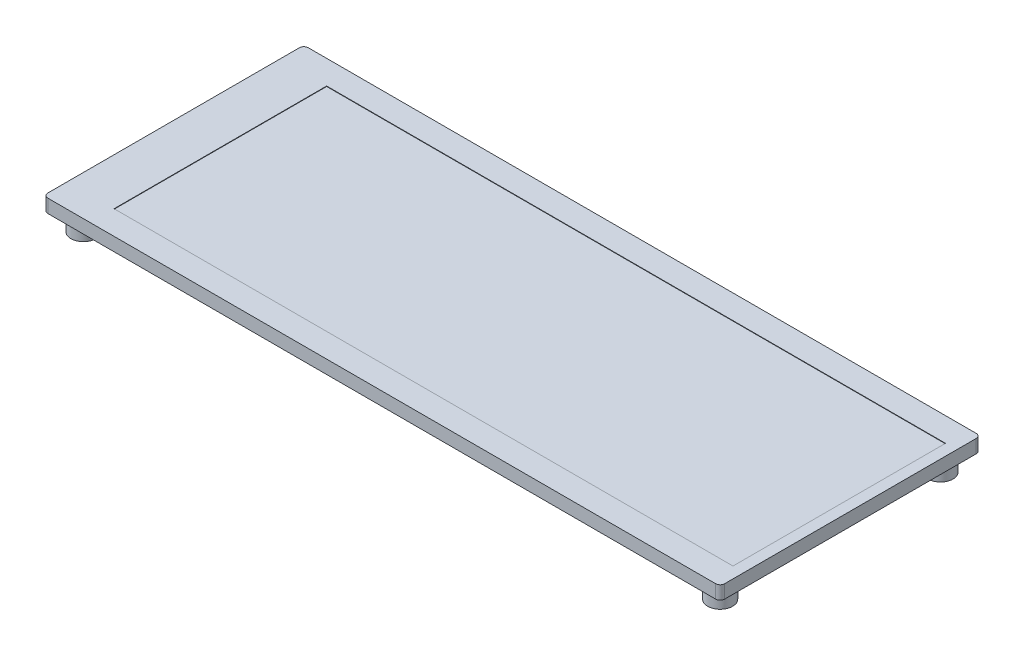
ISO-10303-21;
HEADER;
FILE_DESCRIPTION(('STEP AP214'),'2;1');
FILE_NAME('part.step','',(''),(''),'','','');
FILE_SCHEMA(('AUTOMOTIVE_DESIGN { 1 0 10303 214 1 1 1 1 }'));
ENDSEC;
DATA;
#1=APPLICATION_CONTEXT('core data for automotive mechanical design processes');
#2=APPLICATION_PROTOCOL_DEFINITION('international standard','automotive_design',2000,#1);
#3=PRODUCT_CONTEXT('',#1,'mechanical');
#4=PRODUCT('Part','Part','',(#3));
#5=PRODUCT_RELATED_PRODUCT_CATEGORY('part','',(#4));
#6=PRODUCT_DEFINITION_FORMATION('','',#4);
#7=PRODUCT_DEFINITION_CONTEXT('part definition',#1,'design');
#8=PRODUCT_DEFINITION('design','',#6,#7);
#9=PRODUCT_DEFINITION_SHAPE('','',#8);
#10=(LENGTH_UNIT() NAMED_UNIT(*) SI_UNIT(.MILLI.,.METRE.));
#11=(NAMED_UNIT(*) PLANE_ANGLE_UNIT() SI_UNIT($,.RADIAN.));
#12=(NAMED_UNIT(*) SI_UNIT($,.STERADIAN.) SOLID_ANGLE_UNIT());
#13=UNCERTAINTY_MEASURE_WITH_UNIT(LENGTH_MEASURE(1.E-05),#10,'distance_accuracy_value','');
#14=(GEOMETRIC_REPRESENTATION_CONTEXT(3) GLOBAL_UNCERTAINTY_ASSIGNED_CONTEXT((#13)) GLOBAL_UNIT_ASSIGNED_CONTEXT((#10,
#11,#12)) REPRESENTATION_CONTEXT('',''));
#15=CARTESIAN_POINT('',(0.,0.,0.));
#16=DIRECTION('',(0.,0.,1.));
#17=DIRECTION('',(1.,0.,0.));
#18=AXIS2_PLACEMENT_3D('',#15,#16,#17);
#19=CARTESIAN_POINT('',(75.,0.,-28.25));
#20=DIRECTION('',(0.,-1.,0.));
#21=DIRECTION('',(0.,0.,-1.));
#22=AXIS2_PLACEMENT_3D('',#19,#20,#21);
#23=PLANE('',#22);
#24=CARTESIAN_POINT('',(71.5,0.,-24.75));
#25=DIRECTION('',(0.,-1.,0.));
#26=DIRECTION('',(0.,0.,1.));
#27=AXIS2_PLACEMENT_3D('',#24,#25,#26);
#28=CIRCLE('',#27,2.79999999999999);
#29=CARTESIAN_POINT('',(71.5,0.,-21.95));
#30=VERTEX_POINT('',#29);
#31=EDGE_CURVE('E243',#30,#30,#28,.T.);
#32=ORIENTED_EDGE('',*,*,#31,.F.);
#33=EDGE_LOOP('',(#32));
#34=FACE_BOUND('',#33,.T.);
#35=CARTESIAN_POINT('',(71.5,0.,24.75));
#36=DIRECTION('',(0.,-1.,0.));
#37=DIRECTION('',(0.,0.,-1.));
#38=AXIS2_PLACEMENT_3D('',#35,#36,#37);
#39=CIRCLE('',#38,2.79999999999999);
#40=CARTESIAN_POINT('',(71.5,0.,21.95));
#41=VERTEX_POINT('',#40);
#42=EDGE_CURVE('E11',#41,#41,#39,.T.);
#43=ORIENTED_EDGE('',*,*,#42,.F.);
#44=EDGE_LOOP('',(#43));
#45=FACE_BOUND('',#44,.T.);
#46=CARTESIAN_POINT('',(-71.5,0.,-24.75));
#47=DIRECTION('',(0.,-1.,0.));
#48=DIRECTION('',(0.,0.,-1.));
#49=AXIS2_PLACEMENT_3D('',#46,#47,#48);
#50=CIRCLE('',#49,2.79999999999999);
#51=CARTESIAN_POINT('',(-71.5,0.,-27.55));
#52=VERTEX_POINT('',#51);
#53=EDGE_CURVE('E41',#52,#52,#50,.T.);
#54=ORIENTED_EDGE('',*,*,#53,.F.);
#55=EDGE_LOOP('',(#54));
#56=FACE_BOUND('',#55,.T.);
#57=CARTESIAN_POINT('',(-71.5,0.,24.75));
#58=DIRECTION('',(0.,-1.,0.));
#59=DIRECTION('',(0.,0.,-1.));
#60=AXIS2_PLACEMENT_3D('',#57,#58,#59);
#61=CIRCLE('',#60,2.79999999999999);
#62=CARTESIAN_POINT('',(-71.5,0.,21.95));
#63=VERTEX_POINT('',#62);
#64=EDGE_CURVE('E261',#63,#63,#61,.T.);
#65=ORIENTED_EDGE('',*,*,#64,.F.);
#66=EDGE_LOOP('',(#65));
#67=FACE_BOUND('',#66,.T.);
#68=CARTESIAN_POINT('',(75.,0.,-28.25));
#69=DIRECTION('',(0.,1.,0.));
#70=DIRECTION('',(0.,0.,-1.));
#71=AXIS2_PLACEMENT_3D('',#68,#69,#70);
#72=CIRCLE('',#71,1.);
#73=CARTESIAN_POINT('',(76.,0.,-28.25));
#74=VERTEX_POINT('',#73);
#75=CARTESIAN_POINT('',(75.,0.,-29.25));
#76=VERTEX_POINT('',#75);
#77=EDGE_CURVE('E295',#74,#76,#72,.T.);
#78=ORIENTED_EDGE('',*,*,#77,.F.);
#79=DIRECTION('',(0.,0.,-1.));
#80=VECTOR('',#79,1.);
#81=CARTESIAN_POINT('',(76.,0.,-28.25));
#82=LINE('',#81,#80);
#83=CARTESIAN_POINT('',(76.,0.,28.25));
#84=VERTEX_POINT('',#83);
#85=EDGE_CURVE('E306',#84,#74,#82,.T.);
#86=ORIENTED_EDGE('',*,*,#85,.F.);
#87=CARTESIAN_POINT('',(75.,0.,28.25));
#88=DIRECTION('',(0.,1.,0.));
#89=DIRECTION('',(0.,0.,1.));
#90=AXIS2_PLACEMENT_3D('',#87,#88,#89);
#91=CIRCLE('',#90,1.);
#92=CARTESIAN_POINT('',(75.,0.,29.25));
#93=VERTEX_POINT('',#92);
#94=EDGE_CURVE('E333',#93,#84,#91,.T.);
#95=ORIENTED_EDGE('',*,*,#94,.F.);
#96=DIRECTION('',(1.,0.,0.));
#97=VECTOR('',#96,1.);
#98=CARTESIAN_POINT('',(-75.,0.,29.25));
#99=LINE('',#98,#97);
#100=CARTESIAN_POINT('',(-75.,0.,29.25));
#101=VERTEX_POINT('',#100);
#102=EDGE_CURVE('E331',#101,#93,#99,.T.);
#103=ORIENTED_EDGE('',*,*,#102,.F.);
#104=CARTESIAN_POINT('',(-75.,0.,28.25));
#105=DIRECTION('',(0.,1.,0.));
#106=DIRECTION('',(0.,0.,1.));
#107=AXIS2_PLACEMENT_3D('',#104,#105,#106);
#108=CIRCLE('',#107,1.);
#109=CARTESIAN_POINT('',(-76.,0.,28.25));
#110=VERTEX_POINT('',#109);
#111=EDGE_CURVE('E329',#110,#101,#108,.T.);
#112=ORIENTED_EDGE('',*,*,#111,.F.);
#113=DIRECTION('',(0.,0.,1.));
#114=VECTOR('',#113,1.);
#115=CARTESIAN_POINT('',(-76.,0.,-28.25));
#116=LINE('',#115,#114);
#117=CARTESIAN_POINT('',(-76.,0.,-28.25));
#118=VERTEX_POINT('',#117);
#119=EDGE_CURVE('E327',#118,#110,#116,.T.);
#120=ORIENTED_EDGE('',*,*,#119,.F.);
#121=CARTESIAN_POINT('',(-75.,0.,-28.25));
#122=DIRECTION('',(0.,1.,0.));
#123=DIRECTION('',(0.,0.,1.));
#124=AXIS2_PLACEMENT_3D('',#121,#122,#123);
#125=CIRCLE('',#124,1.);
#126=CARTESIAN_POINT('',(-75.,0.,-29.25));
#127=VERTEX_POINT('',#126);
#128=EDGE_CURVE('E325',#127,#118,#125,.T.);
#129=ORIENTED_EDGE('',*,*,#128,.F.);
#130=DIRECTION('',(-1.,0.,0.));
#131=VECTOR('',#130,1.);
#132=CARTESIAN_POINT('',(-75.,0.,-29.25));
#133=LINE('',#132,#131);
#134=EDGE_CURVE('E323',#76,#127,#133,.T.);
#135=ORIENTED_EDGE('',*,*,#134,.F.);
#136=EDGE_LOOP('',(#78,#86,#95,#103,#112,#120,#129,#135));
#137=FACE_BOUND('',#136,.T.);
#138=DIRECTION('',(-1.,0.,0.));
#139=VECTOR('',#138,1.);
#140=CARTESIAN_POINT('',(-63.,0.,5.5));
#141=LINE('',#140,#139);
#142=CARTESIAN_POINT('',(-57.,0.,5.5));
#143=VERTEX_POINT('',#142);
#144=CARTESIAN_POINT('',(-63.,0.,5.5));
#145=VERTEX_POINT('',#144);
#146=EDGE_CURVE('E199',#143,#145,#141,.T.);
#147=ORIENTED_EDGE('',*,*,#146,.F.);
#148=DIRECTION('',(0.,0.,1.));
#149=VECTOR('',#148,1.);
#150=CARTESIAN_POINT('',(-57.,0.,5.5));
#151=LINE('',#150,#149);
#152=CARTESIAN_POINT('',(-57.,0.,-5.5));
#153=VERTEX_POINT('',#152);
#154=EDGE_CURVE('E196',#153,#143,#151,.T.);
#155=ORIENTED_EDGE('',*,*,#154,.F.);
#156=DIRECTION('',(1.,0.,0.));
#157=VECTOR('',#156,1.);
#158=CARTESIAN_POINT('',(-63.,0.,-5.5));
#159=LINE('',#158,#157);
#160=CARTESIAN_POINT('',(-63.,0.,-5.5));
#161=VERTEX_POINT('',#160);
#162=EDGE_CURVE('E208',#161,#153,#159,.T.);
#163=ORIENTED_EDGE('',*,*,#162,.F.);
#164=DIRECTION('',(0.,0.,-1.));
#165=VECTOR('',#164,1.);
#166=CARTESIAN_POINT('',(-63.,0.,5.5));
#167=LINE('',#166,#165);
#168=EDGE_CURVE('E216',#145,#161,#167,.T.);
#169=ORIENTED_EDGE('',*,*,#168,.F.);
#170=EDGE_LOOP('',(#147,#155,#163,#169));
#171=FACE_BOUND('',#170,.T.);
#172=DIRECTION('',(-1.,0.,0.));
#173=VECTOR('',#172,1.);
#174=CARTESIAN_POINT('',(61.5,0.,8.5));
#175=LINE('',#174,#173);
#176=CARTESIAN_POINT('',(67.5,0.,8.5));
#177=VERTEX_POINT('',#176);
#178=CARTESIAN_POINT('',(61.5,0.,8.5));
#179=VERTEX_POINT('',#178);
#180=EDGE_CURVE('E377',#177,#179,#175,.T.);
#181=ORIENTED_EDGE('',*,*,#180,.F.);
#182=DIRECTION('',(0.,0.,1.));
#183=VECTOR('',#182,1.);
#184=CARTESIAN_POINT('',(67.5,0.,8.5));
#185=LINE('',#184,#183);
#186=CARTESIAN_POINT('',(67.5,0.,-8.5));
#187=VERTEX_POINT('',#186);
#188=EDGE_CURVE('E194',#187,#177,#185,.T.);
#189=ORIENTED_EDGE('',*,*,#188,.F.);
#190=DIRECTION('',(1.,0.,0.));
#191=VECTOR('',#190,1.);
#192=CARTESIAN_POINT('',(61.5,0.,-8.5));
#193=LINE('',#192,#191);
#194=CARTESIAN_POINT('',(61.5,0.,-8.5));
#195=VERTEX_POINT('',#194);
#196=EDGE_CURVE('E190',#195,#187,#193,.T.);
#197=ORIENTED_EDGE('',*,*,#196,.F.);
#198=DIRECTION('',(0.,0.,-1.));
#199=VECTOR('',#198,1.);
#200=CARTESIAN_POINT('',(61.5,0.,8.5));
#201=LINE('',#200,#199);
#202=EDGE_CURVE('E379',#179,#195,#201,.T.);
#203=ORIENTED_EDGE('',*,*,#202,.F.);
#204=EDGE_LOOP('',(#181,#189,#197,#203));
#205=FACE_BOUND('',#204,.T.);
#206=ADVANCED_FACE('F33',(#34,#45,#56,#67,#137,#171,#205),#23,.T.);
#207=CARTESIAN_POINT('',(75.,3.,-28.25));
#208=DIRECTION('',(0.,-1.,0.));
#209=DIRECTION('',(0.,0.,-1.));
#210=AXIS2_PLACEMENT_3D('',#207,#208,#209);
#211=CYLINDRICAL_SURFACE('',#210,1.);
#212=ORIENTED_EDGE('',*,*,#77,.T.);
#213=DIRECTION('',(0.,-1.,0.));
#214=VECTOR('',#213,1.);
#215=CARTESIAN_POINT('',(75.,3.,-29.25));
#216=LINE('',#215,#214);
#217=CARTESIAN_POINT('',(75.,3.,-29.25));
#218=VERTEX_POINT('',#217);
#219=EDGE_CURVE('E356',#218,#76,#216,.T.);
#220=ORIENTED_EDGE('',*,*,#219,.F.);
#221=CARTESIAN_POINT('',(75.,3.,-28.25));
#222=DIRECTION('',(0.,1.,0.));
#223=DIRECTION('',(0.,0.,-1.));
#224=AXIS2_PLACEMENT_3D('',#221,#222,#223);
#225=CIRCLE('',#224,1.);
#226=CARTESIAN_POINT('',(76.,3.,-28.25));
#227=VERTEX_POINT('',#226);
#228=EDGE_CURVE('E302',#227,#218,#225,.T.);
#229=ORIENTED_EDGE('',*,*,#228,.F.);
#230=DIRECTION('',(0.,-1.,0.));
#231=VECTOR('',#230,1.);
#232=CARTESIAN_POINT('',(76.,3.,-28.25));
#233=LINE('',#232,#231);
#234=EDGE_CURVE('E320',#227,#74,#233,.T.);
#235=ORIENTED_EDGE('',*,*,#234,.T.);
#236=EDGE_LOOP('',(#212,#220,#229,#235));
#237=FACE_BOUND('',#236,.T.);
#238=ADVANCED_FACE('F35',(#237),#211,.T.);
#239=CARTESIAN_POINT('',(-75.,3.,-29.25));
#240=DIRECTION('',(0.,0.,1.));
#241=DIRECTION('',(1.,0.,0.));
#242=AXIS2_PLACEMENT_3D('',#239,#240,#241);
#243=PLANE('',#242);
#244=ORIENTED_EDGE('',*,*,#134,.T.);
#245=DIRECTION('',(0.,-1.,0.));
#246=VECTOR('',#245,1.);
#247=CARTESIAN_POINT('',(-75.,3.,-29.25));
#248=LINE('',#247,#246);
#249=CARTESIAN_POINT('',(-75.,3.,-29.25));
#250=VERTEX_POINT('',#249);
#251=EDGE_CURVE('E353',#250,#127,#248,.T.);
#252=ORIENTED_EDGE('',*,*,#251,.F.);
#253=DIRECTION('',(-1.,0.,0.));
#254=VECTOR('',#253,1.);
#255=CARTESIAN_POINT('',(-75.,3.,-29.25));
#256=LINE('',#255,#254);
#257=EDGE_CURVE('E305',#218,#250,#256,.T.);
#258=ORIENTED_EDGE('',*,*,#257,.F.);
#259=ORIENTED_EDGE('',*,*,#219,.T.);
#260=EDGE_LOOP('',(#244,#252,#258,#259));
#261=FACE_BOUND('',#260,.T.);
#262=ADVANCED_FACE('F532',(#261),#243,.F.);
#263=CARTESIAN_POINT('',(-75.,3.,-28.25));
#264=DIRECTION('',(0.,-1.,0.));
#265=DIRECTION('',(0.,0.,-1.));
#266=AXIS2_PLACEMENT_3D('',#263,#264,#265);
#267=CYLINDRICAL_SURFACE('',#266,1.);
#268=ORIENTED_EDGE('',*,*,#128,.T.);
#269=DIRECTION('',(0.,-1.,0.));
#270=VECTOR('',#269,1.);
#271=CARTESIAN_POINT('',(-76.,3.,-28.25));
#272=LINE('',#271,#270);
#273=CARTESIAN_POINT('',(-76.,3.,-28.25));
#274=VERTEX_POINT('',#273);
#275=EDGE_CURVE('E350',#274,#118,#272,.T.);
#276=ORIENTED_EDGE('',*,*,#275,.F.);
#277=CARTESIAN_POINT('',(-75.,3.,-28.25));
#278=DIRECTION('',(0.,1.,0.));
#279=DIRECTION('',(0.,0.,1.));
#280=AXIS2_PLACEMENT_3D('',#277,#278,#279);
#281=CIRCLE('',#280,1.);
#282=EDGE_CURVE('E308',#250,#274,#281,.T.);
#283=ORIENTED_EDGE('',*,*,#282,.F.);
#284=ORIENTED_EDGE('',*,*,#251,.T.);
#285=EDGE_LOOP('',(#268,#276,#283,#284));
#286=FACE_BOUND('',#285,.T.);
#287=ADVANCED_FACE('F529',(#286),#267,.T.);
#288=CARTESIAN_POINT('',(-76.,3.,-28.25));
#289=DIRECTION('',(1.,0.,0.));
#290=DIRECTION('',(0.,0.,-1.));
#291=AXIS2_PLACEMENT_3D('',#288,#289,#290);
#292=PLANE('',#291);
#293=ORIENTED_EDGE('',*,*,#119,.T.);
#294=DIRECTION('',(0.,-1.,0.));
#295=VECTOR('',#294,1.);
#296=CARTESIAN_POINT('',(-76.,3.,28.25));
#297=LINE('',#296,#295);
#298=CARTESIAN_POINT('',(-76.,3.,28.25));
#299=VERTEX_POINT('',#298);
#300=EDGE_CURVE('E347',#299,#110,#297,.T.);
#301=ORIENTED_EDGE('',*,*,#300,.F.);
#302=DIRECTION('',(0.,0.,1.));
#303=VECTOR('',#302,1.);
#304=CARTESIAN_POINT('',(-76.,3.,-28.25));
#305=LINE('',#304,#303);
#306=EDGE_CURVE('E310',#274,#299,#305,.T.);
#307=ORIENTED_EDGE('',*,*,#306,.F.);
#308=ORIENTED_EDGE('',*,*,#275,.T.);
#309=EDGE_LOOP('',(#293,#301,#307,#308));
#310=FACE_BOUND('',#309,.T.);
#311=ADVANCED_FACE('F525',(#310),#292,.F.);
#312=CARTESIAN_POINT('',(-75.,3.,28.25));
#313=DIRECTION('',(0.,-1.,0.));
#314=DIRECTION('',(0.,0.,-1.));
#315=AXIS2_PLACEMENT_3D('',#312,#313,#314);
#316=CYLINDRICAL_SURFACE('',#315,1.);
#317=ORIENTED_EDGE('',*,*,#111,.T.);
#318=DIRECTION('',(0.,-1.,0.));
#319=VECTOR('',#318,1.);
#320=CARTESIAN_POINT('',(-75.,3.,29.25));
#321=LINE('',#320,#319);
#322=CARTESIAN_POINT('',(-75.,3.,29.25));
#323=VERTEX_POINT('',#322);
#324=EDGE_CURVE('E344',#323,#101,#321,.T.);
#325=ORIENTED_EDGE('',*,*,#324,.F.);
#326=CARTESIAN_POINT('',(-75.,3.,28.25));
#327=DIRECTION('',(0.,1.,0.));
#328=DIRECTION('',(0.,0.,1.));
#329=AXIS2_PLACEMENT_3D('',#326,#327,#328);
#330=CIRCLE('',#329,1.);
#331=EDGE_CURVE('E312',#299,#323,#330,.T.);
#332=ORIENTED_EDGE('',*,*,#331,.F.);
#333=ORIENTED_EDGE('',*,*,#300,.T.);
#334=EDGE_LOOP('',(#317,#325,#332,#333));
#335=FACE_BOUND('',#334,.T.);
#336=ADVANCED_FACE('F521',(#335),#316,.T.);
#337=CARTESIAN_POINT('',(-75.,3.,29.25));
#338=DIRECTION('',(0.,0.,-1.));
#339=DIRECTION('',(-1.,0.,0.));
#340=AXIS2_PLACEMENT_3D('',#337,#338,#339);
#341=PLANE('',#340);
#342=ORIENTED_EDGE('',*,*,#102,.T.);
#343=DIRECTION('',(0.,-1.,0.));
#344=VECTOR('',#343,1.);
#345=CARTESIAN_POINT('',(75.,3.,29.25));
#346=LINE('',#345,#344);
#347=CARTESIAN_POINT('',(75.,3.,29.25));
#348=VERTEX_POINT('',#347);
#349=EDGE_CURVE('E341',#348,#93,#346,.T.);
#350=ORIENTED_EDGE('',*,*,#349,.F.);
#351=DIRECTION('',(1.,0.,0.));
#352=VECTOR('',#351,1.);
#353=CARTESIAN_POINT('',(-75.,3.,29.25));
#354=LINE('',#353,#352);
#355=EDGE_CURVE('E314',#323,#348,#354,.T.);
#356=ORIENTED_EDGE('',*,*,#355,.F.);
#357=ORIENTED_EDGE('',*,*,#324,.T.);
#358=EDGE_LOOP('',(#342,#350,#356,#357));
#359=FACE_BOUND('',#358,.T.);
#360=ADVANCED_FACE('F517',(#359),#341,.F.);
#361=CARTESIAN_POINT('',(75.,3.,28.25));
#362=DIRECTION('',(0.,-1.,0.));
#363=DIRECTION('',(0.,0.,-1.));
#364=AXIS2_PLACEMENT_3D('',#361,#362,#363);
#365=CYLINDRICAL_SURFACE('',#364,1.);
#366=ORIENTED_EDGE('',*,*,#94,.T.);
#367=DIRECTION('',(0.,-1.,0.));
#368=VECTOR('',#367,1.);
#369=CARTESIAN_POINT('',(76.,3.,28.25));
#370=LINE('',#369,#368);
#371=CARTESIAN_POINT('',(76.,3.,28.25));
#372=VERTEX_POINT('',#371);
#373=EDGE_CURVE('E338',#372,#84,#370,.T.);
#374=ORIENTED_EDGE('',*,*,#373,.F.);
#375=CARTESIAN_POINT('',(75.,3.,28.25));
#376=DIRECTION('',(0.,1.,0.));
#377=DIRECTION('',(0.,0.,1.));
#378=AXIS2_PLACEMENT_3D('',#375,#376,#377);
#379=CIRCLE('',#378,1.);
#380=EDGE_CURVE('E316',#348,#372,#379,.T.);
#381=ORIENTED_EDGE('',*,*,#380,.F.);
#382=ORIENTED_EDGE('',*,*,#349,.T.);
#383=EDGE_LOOP('',(#366,#374,#381,#382));
#384=FACE_BOUND('',#383,.T.);
#385=ADVANCED_FACE('F513',(#384),#365,.T.);
#386=CARTESIAN_POINT('',(76.,3.,-28.25));
#387=DIRECTION('',(-1.,0.,0.));
#388=DIRECTION('',(0.,0.,1.));
#389=AXIS2_PLACEMENT_3D('',#386,#387,#388);
#390=PLANE('',#389);
#391=ORIENTED_EDGE('',*,*,#85,.T.);
#392=ORIENTED_EDGE('',*,*,#234,.F.);
#393=DIRECTION('',(0.,0.,-1.));
#394=VECTOR('',#393,1.);
#395=CARTESIAN_POINT('',(76.,3.,-28.25));
#396=LINE('',#395,#394);
#397=EDGE_CURVE('E318',#372,#227,#396,.T.);
#398=ORIENTED_EDGE('',*,*,#397,.F.);
#399=ORIENTED_EDGE('',*,*,#373,.T.);
#400=EDGE_LOOP('',(#391,#392,#398,#399));
#401=FACE_BOUND('',#400,.T.);
#402=ADVANCED_FACE('F508',(#401),#390,.F.);
#403=CARTESIAN_POINT('',(75.,3.,-28.25));
#404=DIRECTION('',(0.,-1.,0.));
#405=DIRECTION('',(0.,0.,-1.));
#406=AXIS2_PLACEMENT_3D('',#403,#404,#405);
#407=PLANE('',#406);
#408=DIRECTION('',(-1.,0.,0.));
#409=VECTOR('',#408,1.);
#410=CARTESIAN_POINT('',(-65.5,3.,-23.87));
#411=LINE('',#410,#409);
#412=CARTESIAN_POINT('',(73.5,3.,-23.87));
#413=VERTEX_POINT('',#412);
#414=CARTESIAN_POINT('',(-65.5,3.,-23.87));
#415=VERTEX_POINT('',#414);
#416=EDGE_CURVE('E285',#413,#415,#411,.T.);
#417=ORIENTED_EDGE('',*,*,#416,.F.);
#418=DIRECTION('',(0.,0.,-1.));
#419=VECTOR('',#418,1.);
#420=CARTESIAN_POINT('',(73.5,3.,-23.87));
#421=LINE('',#420,#419);
#422=CARTESIAN_POINT('',(73.5,3.,23.87));
#423=VERTEX_POINT('',#422);
#424=EDGE_CURVE('E267',#423,#413,#421,.T.);
#425=ORIENTED_EDGE('',*,*,#424,.F.);
#426=DIRECTION('',(1.,0.,0.));
#427=VECTOR('',#426,1.);
#428=CARTESIAN_POINT('',(-65.5,3.,23.87));
#429=LINE('',#428,#427);
#430=CARTESIAN_POINT('',(-65.5,3.,23.87));
#431=VERTEX_POINT('',#430);
#432=EDGE_CURVE('E274',#431,#423,#429,.T.);
#433=ORIENTED_EDGE('',*,*,#432,.F.);
#434=DIRECTION('',(0.,0.,1.));
#435=VECTOR('',#434,1.);
#436=CARTESIAN_POINT('',(-65.5,3.,-23.87));
#437=LINE('',#436,#435);
#438=EDGE_CURVE('E288',#415,#431,#437,.T.);
#439=ORIENTED_EDGE('',*,*,#438,.F.);
#440=EDGE_LOOP('',(#417,#425,#433,#439));
#441=FACE_BOUND('',#440,.T.);
#442=ORIENTED_EDGE('',*,*,#228,.T.);
#443=ORIENTED_EDGE('',*,*,#257,.T.);
#444=ORIENTED_EDGE('',*,*,#282,.T.);
#445=ORIENTED_EDGE('',*,*,#306,.T.);
#446=ORIENTED_EDGE('',*,*,#331,.T.);
#447=ORIENTED_EDGE('',*,*,#355,.T.);
#448=ORIENTED_EDGE('',*,*,#380,.T.);
#449=ORIENTED_EDGE('',*,*,#397,.T.);
#450=EDGE_LOOP('',(#442,#443,#444,#445,#446,#447,#448,#449));
#451=FACE_BOUND('',#450,.T.);
#452=ADVANCED_FACE('F505',(#441,#451),#407,.F.);
#453=CARTESIAN_POINT('',(73.5,2.9,-23.87));
#454=DIRECTION('',(1.,0.,0.));
#455=DIRECTION('',(0.,0.,-1.));
#456=AXIS2_PLACEMENT_3D('',#453,#454,#455);
#457=PLANE('',#456);
#458=ORIENTED_EDGE('',*,*,#424,.T.);
#459=DIRECTION('',(0.,1.,0.));
#460=VECTOR('',#459,1.);
#461=CARTESIAN_POINT('',(73.5,2.9,-23.87));
#462=LINE('',#461,#460);
#463=CARTESIAN_POINT('',(73.5,2.9,-23.87));
#464=VERTEX_POINT('',#463);
#465=EDGE_CURVE('E283',#464,#413,#462,.T.);
#466=ORIENTED_EDGE('',*,*,#465,.F.);
#467=DIRECTION('',(0.,0.,-1.));
#468=VECTOR('',#467,1.);
#469=CARTESIAN_POINT('',(73.5,2.9,-23.87));
#470=LINE('',#469,#468);
#471=CARTESIAN_POINT('',(73.5,2.9,23.87));
#472=VERTEX_POINT('',#471);
#473=EDGE_CURVE('E270',#472,#464,#470,.T.);
#474=ORIENTED_EDGE('',*,*,#473,.F.);
#475=DIRECTION('',(0.,1.,0.));
#476=VECTOR('',#475,1.);
#477=CARTESIAN_POINT('',(73.5,2.9,23.87));
#478=LINE('',#477,#476);
#479=EDGE_CURVE('E293',#472,#423,#478,.T.);
#480=ORIENTED_EDGE('',*,*,#479,.T.);
#481=EDGE_LOOP('',(#458,#466,#474,#480));
#482=FACE_BOUND('',#481,.T.);
#483=ADVANCED_FACE('F495',(#482),#457,.F.);
#484=CARTESIAN_POINT('',(-65.5,2.9,23.87));
#485=DIRECTION('',(0.,0.,1.));
#486=DIRECTION('',(1.,0.,0.));
#487=AXIS2_PLACEMENT_3D('',#484,#485,#486);
#488=PLANE('',#487);
#489=ORIENTED_EDGE('',*,*,#432,.T.);
#490=ORIENTED_EDGE('',*,*,#479,.F.);
#491=DIRECTION('',(1.,0.,0.));
#492=VECTOR('',#491,1.);
#493=CARTESIAN_POINT('',(-65.5,2.9,23.87));
#494=LINE('',#493,#492);
#495=CARTESIAN_POINT('',(-65.5,2.9,23.87));
#496=VERTEX_POINT('',#495);
#497=EDGE_CURVE('E280',#496,#472,#494,.T.);
#498=ORIENTED_EDGE('',*,*,#497,.F.);
#499=DIRECTION('',(0.,1.,0.));
#500=VECTOR('',#499,1.);
#501=CARTESIAN_POINT('',(-65.5,2.9,23.87));
#502=LINE('',#501,#500);
#503=EDGE_CURVE('E296',#496,#431,#502,.T.);
#504=ORIENTED_EDGE('',*,*,#503,.T.);
#505=EDGE_LOOP('',(#489,#490,#498,#504));
#506=FACE_BOUND('',#505,.T.);
#507=ADVANCED_FACE('F491',(#506),#488,.F.);
#508=CARTESIAN_POINT('',(-65.5,2.9,-23.87));
#509=DIRECTION('',(-1.,0.,0.));
#510=DIRECTION('',(0.,0.,1.));
#511=AXIS2_PLACEMENT_3D('',#508,#509,#510);
#512=PLANE('',#511);
#513=ORIENTED_EDGE('',*,*,#438,.T.);
#514=ORIENTED_EDGE('',*,*,#503,.F.);
#515=DIRECTION('',(0.,0.,1.));
#516=VECTOR('',#515,1.);
#517=CARTESIAN_POINT('',(-65.5,2.9,-23.87));
#518=LINE('',#517,#516);
#519=CARTESIAN_POINT('',(-65.5,2.9,-23.87));
#520=VERTEX_POINT('',#519);
#521=EDGE_CURVE('E277',#520,#496,#518,.T.);
#522=ORIENTED_EDGE('',*,*,#521,.F.);
#523=DIRECTION('',(0.,1.,0.));
#524=VECTOR('',#523,1.);
#525=CARTESIAN_POINT('',(-65.5,2.9,-23.87));
#526=LINE('',#525,#524);
#527=EDGE_CURVE('E298',#520,#415,#526,.T.);
#528=ORIENTED_EDGE('',*,*,#527,.T.);
#529=EDGE_LOOP('',(#513,#514,#522,#528));
#530=FACE_BOUND('',#529,.T.);
#531=ADVANCED_FACE('F494',(#530),#512,.F.);
#532=CARTESIAN_POINT('',(-65.5,2.9,-23.87));
#533=DIRECTION('',(0.,0.,-1.));
#534=DIRECTION('',(-1.,0.,0.));
#535=AXIS2_PLACEMENT_3D('',#532,#533,#534);
#536=PLANE('',#535);
#537=ORIENTED_EDGE('',*,*,#416,.T.);
#538=ORIENTED_EDGE('',*,*,#527,.F.);
#539=DIRECTION('',(-1.,0.,0.));
#540=VECTOR('',#539,1.);
#541=CARTESIAN_POINT('',(-65.5,2.9,-23.87));
#542=LINE('',#541,#540);
#543=EDGE_CURVE('E273',#464,#520,#542,.T.);
#544=ORIENTED_EDGE('',*,*,#543,.F.);
#545=ORIENTED_EDGE('',*,*,#465,.T.);
#546=EDGE_LOOP('',(#537,#538,#544,#545));
#547=FACE_BOUND('',#546,.T.);
#548=ADVANCED_FACE('F489',(#547),#536,.F.);
#549=CARTESIAN_POINT('',(0.,2.9,0.));
#550=DIRECTION('',(0.,1.,0.));
#551=DIRECTION('',(0.,0.,1.));
#552=AXIS2_PLACEMENT_3D('',#549,#550,#551);
#553=PLANE('',#552);
#554=ORIENTED_EDGE('',*,*,#473,.T.);
#555=ORIENTED_EDGE('',*,*,#543,.T.);
#556=ORIENTED_EDGE('',*,*,#521,.T.);
#557=ORIENTED_EDGE('',*,*,#497,.T.);
#558=EDGE_LOOP('',(#554,#555,#556,#557));
#559=FACE_BOUND('',#558,.T.);
#560=ADVANCED_FACE('F485',(#559),#553,.T.);
#561=CARTESIAN_POINT('',(-71.5,-4.,24.75));
#562=DIRECTION('',(0.,1.,0.));
#563=DIRECTION('',(0.,0.,1.));
#564=AXIS2_PLACEMENT_3D('',#561,#562,#563);
#565=CYLINDRICAL_SURFACE('',#564,2.79999999999999);
#566=CARTESIAN_POINT('',(-71.5,-4.,24.75));
#567=DIRECTION('',(0.,-1.,0.));
#568=DIRECTION('',(0.,0.,-1.));
#569=AXIS2_PLACEMENT_3D('',#566,#567,#568);
#570=CIRCLE('',#569,2.79999999999999);
#571=CARTESIAN_POINT('',(-71.5,-4.,21.95));
#572=VERTEX_POINT('',#571);
#573=EDGE_CURVE('E264',#572,#572,#570,.T.);
#574=ORIENTED_EDGE('',*,*,#573,.F.);
#575=EDGE_LOOP('',(#574));
#576=FACE_BOUND('',#575,.T.);
#577=ORIENTED_EDGE('',*,*,#64,.T.);
#578=EDGE_LOOP('',(#577));
#579=FACE_BOUND('',#578,.T.);
#580=ADVANCED_FACE('F481',(#576,#579),#565,.T.);
#581=CARTESIAN_POINT('',(-71.5,-4.,24.75));
#582=DIRECTION('',(0.,-1.,0.));
#583=DIRECTION('',(0.,0.,-1.));
#584=AXIS2_PLACEMENT_3D('',#581,#582,#583);
#585=PLANE('',#584);
#586=CARTESIAN_POINT('',(-71.5,-4.,24.75));
#587=DIRECTION('',(0.,-1.,0.));
#588=DIRECTION('',(0.,0.,-1.));
#589=AXIS2_PLACEMENT_3D('',#586,#587,#588);
#590=CIRCLE('',#589,0.999999999999998);
#591=CARTESIAN_POINT('',(-71.5,-4.,23.75));
#592=VERTEX_POINT('',#591);
#593=EDGE_CURVE('E257',#592,#592,#590,.T.);
#594=ORIENTED_EDGE('',*,*,#593,.F.);
#595=EDGE_LOOP('',(#594));
#596=FACE_BOUND('',#595,.T.);
#597=ORIENTED_EDGE('',*,*,#573,.T.);
#598=EDGE_LOOP('',(#597));
#599=FACE_BOUND('',#598,.T.);
#600=ADVANCED_FACE('F477',(#596,#599),#585,.T.);
#601=CARTESIAN_POINT('',(-71.5,0.,24.75));
#602=DIRECTION('',(0.,-1.,0.));
#603=DIRECTION('',(0.,0.,-1.));
#604=AXIS2_PLACEMENT_3D('',#601,#602,#603);
#605=CYLINDRICAL_SURFACE('',#604,0.999999999999998);
#606=CARTESIAN_POINT('',(-71.5,0.,24.75));
#607=DIRECTION('',(0.,-1.,0.));
#608=DIRECTION('',(0.,0.,-1.));
#609=AXIS2_PLACEMENT_3D('',#606,#607,#608);
#610=CIRCLE('',#609,0.999999999999998);
#611=CARTESIAN_POINT('',(-71.5,0.,23.75));
#612=VERTEX_POINT('',#611);
#613=EDGE_CURVE('E258',#612,#612,#610,.T.);
#614=ORIENTED_EDGE('',*,*,#613,.F.);
#615=EDGE_LOOP('',(#614));
#616=FACE_BOUND('',#615,.T.);
#617=ORIENTED_EDGE('',*,*,#593,.T.);
#618=EDGE_LOOP('',(#617));
#619=FACE_BOUND('',#618,.T.);
#620=ADVANCED_FACE('F473',(#616,#619),#605,.F.);
#621=CARTESIAN_POINT('',(-71.5,0.,24.75));
#622=DIRECTION('',(0.,-1.,0.));
#623=DIRECTION('',(0.,0.,-1.));
#624=AXIS2_PLACEMENT_3D('',#621,#622,#623);
#625=PLANE('',#624);
#626=ORIENTED_EDGE('',*,*,#613,.T.);
#627=EDGE_LOOP('',(#626));
#628=FACE_BOUND('',#627,.T.);
#629=ADVANCED_FACE('F469',(#628),#625,.T.);
#630=CARTESIAN_POINT('',(-71.5,-4.,-24.75));
#631=DIRECTION('',(0.,1.,0.));
#632=DIRECTION('',(0.,0.,1.));
#633=AXIS2_PLACEMENT_3D('',#630,#631,#632);
#634=CYLINDRICAL_SURFACE('',#633,2.79999999999999);
#635=CARTESIAN_POINT('',(-71.5,-4.,-24.75));
#636=DIRECTION('',(0.,1.,0.));
#637=DIRECTION('',(0.,0.,1.));
#638=AXIS2_PLACEMENT_3D('',#635,#636,#637);
#639=CIRCLE('',#638,2.79999999999999);
#640=CARTESIAN_POINT('',(-71.5,-4.,-21.95));
#641=VERTEX_POINT('',#640);
#642=EDGE_CURVE('E254',#641,#641,#639,.T.);
#643=ORIENTED_EDGE('',*,*,#642,.T.);
#644=EDGE_LOOP('',(#643));
#645=FACE_BOUND('',#644,.T.);
#646=ORIENTED_EDGE('',*,*,#53,.T.);
#647=EDGE_LOOP('',(#646));
#648=FACE_BOUND('',#647,.T.);
#649=ADVANCED_FACE('F361',(#645,#648),#634,.T.);
#650=CARTESIAN_POINT('',(-71.5,-4.,-24.75));
#651=DIRECTION('',(0.,-1.,0.));
#652=DIRECTION('',(0.,0.,1.));
#653=AXIS2_PLACEMENT_3D('',#650,#651,#652);
#654=PLANE('',#653);
#655=CARTESIAN_POINT('',(-71.5,-4.,-24.75));
#656=DIRECTION('',(0.,1.,0.));
#657=DIRECTION('',(0.,0.,1.));
#658=AXIS2_PLACEMENT_3D('',#655,#656,#657);
#659=CIRCLE('',#658,0.999999999999998);
#660=CARTESIAN_POINT('',(-71.5,-4.,-23.75));
#661=VERTEX_POINT('',#660);
#662=EDGE_CURVE('E237',#661,#661,#659,.T.);
#663=ORIENTED_EDGE('',*,*,#662,.T.);
#664=EDGE_LOOP('',(#663));
#665=FACE_BOUND('',#664,.T.);
#666=ORIENTED_EDGE('',*,*,#642,.F.);
#667=EDGE_LOOP('',(#666));
#668=FACE_BOUND('',#667,.T.);
#669=ADVANCED_FACE('F462',(#665,#668),#654,.T.);
#670=CARTESIAN_POINT('',(71.5,-4.,24.75));
#671=DIRECTION('',(0.,1.,0.));
#672=DIRECTION('',(0.,0.,1.));
#673=AXIS2_PLACEMENT_3D('',#670,#671,#672);
#674=CYLINDRICAL_SURFACE('',#673,2.79999999999999);
#675=CARTESIAN_POINT('',(71.5,-4.,24.75));
#676=DIRECTION('',(0.,1.,0.));
#677=DIRECTION('',(0.,0.,-1.));
#678=AXIS2_PLACEMENT_3D('',#675,#676,#677);
#679=CIRCLE('',#678,2.79999999999999);
#680=CARTESIAN_POINT('',(71.5,-4.,21.95));
#681=VERTEX_POINT('',#680);
#682=EDGE_CURVE('E249',#681,#681,#679,.T.);
#683=ORIENTED_EDGE('',*,*,#682,.T.);
#684=EDGE_LOOP('',(#683));
#685=FACE_BOUND('',#684,.T.);
#686=ORIENTED_EDGE('',*,*,#42,.T.);
#687=EDGE_LOOP('',(#686));
#688=FACE_BOUND('',#687,.T.);
#689=ADVANCED_FACE('F458',(#685,#688),#674,.T.);
#690=CARTESIAN_POINT('',(71.5,-4.,24.75));
#691=DIRECTION('',(0.,-1.,0.));
#692=DIRECTION('',(0.,0.,-1.));
#693=AXIS2_PLACEMENT_3D('',#690,#691,#692);
#694=PLANE('',#693);
#695=CARTESIAN_POINT('',(71.5,-4.,24.75));
#696=DIRECTION('',(0.,1.,0.));
#697=DIRECTION('',(0.,0.,-1.));
#698=AXIS2_PLACEMENT_3D('',#695,#696,#697);
#699=CIRCLE('',#698,0.999999999999998);
#700=CARTESIAN_POINT('',(71.5,-4.,23.75));
#701=VERTEX_POINT('',#700);
#702=EDGE_CURVE('E231',#701,#701,#699,.T.);
#703=ORIENTED_EDGE('',*,*,#702,.T.);
#704=EDGE_LOOP('',(#703));
#705=FACE_BOUND('',#704,.T.);
#706=ORIENTED_EDGE('',*,*,#682,.F.);
#707=EDGE_LOOP('',(#706));
#708=FACE_BOUND('',#707,.T.);
#709=ADVANCED_FACE('F454',(#705,#708),#694,.T.);
#710=CARTESIAN_POINT('',(71.5,-4.,-24.75));
#711=DIRECTION('',(0.,1.,0.));
#712=DIRECTION('',(0.,0.,1.));
#713=AXIS2_PLACEMENT_3D('',#710,#711,#712);
#714=CYLINDRICAL_SURFACE('',#713,2.79999999999999);
#715=CARTESIAN_POINT('',(71.5,-4.,-24.75));
#716=DIRECTION('',(0.,-1.,0.));
#717=DIRECTION('',(0.,0.,1.));
#718=AXIS2_PLACEMENT_3D('',#715,#716,#717);
#719=CIRCLE('',#718,2.79999999999999);
#720=CARTESIAN_POINT('',(71.5,-4.,-21.95));
#721=VERTEX_POINT('',#720);
#722=EDGE_CURVE('E246',#721,#721,#719,.T.);
#723=ORIENTED_EDGE('',*,*,#722,.F.);
#724=EDGE_LOOP('',(#723));
#725=FACE_BOUND('',#724,.T.);
#726=ORIENTED_EDGE('',*,*,#31,.T.);
#727=EDGE_LOOP('',(#726));
#728=FACE_BOUND('',#727,.T.);
#729=ADVANCED_FACE('F450',(#725,#728),#714,.T.);
#730=CARTESIAN_POINT('',(71.5,-4.,-24.75));
#731=DIRECTION('',(0.,-1.,0.));
#732=DIRECTION('',(0.,0.,1.));
#733=AXIS2_PLACEMENT_3D('',#730,#731,#732);
#734=PLANE('',#733);
#735=CARTESIAN_POINT('',(71.5,-4.,-24.75));
#736=DIRECTION('',(0.,-1.,0.));
#737=DIRECTION('',(0.,0.,1.));
#738=AXIS2_PLACEMENT_3D('',#735,#736,#737);
#739=CIRCLE('',#738,0.999999999999998);
#740=CARTESIAN_POINT('',(71.5,-4.,-23.75));
#741=VERTEX_POINT('',#740);
#742=EDGE_CURVE('E227',#741,#741,#739,.T.);
#743=ORIENTED_EDGE('',*,*,#742,.F.);
#744=EDGE_LOOP('',(#743));
#745=FACE_BOUND('',#744,.T.);
#746=ORIENTED_EDGE('',*,*,#722,.T.);
#747=EDGE_LOOP('',(#746));
#748=FACE_BOUND('',#747,.T.);
#749=ADVANCED_FACE('F446',(#745,#748),#734,.T.);
#750=CARTESIAN_POINT('',(-71.5,0.,-24.75));
#751=DIRECTION('',(0.,-1.,0.));
#752=DIRECTION('',(0.,0.,-1.));
#753=AXIS2_PLACEMENT_3D('',#750,#751,#752);
#754=CYLINDRICAL_SURFACE('',#753,0.999999999999998);
#755=CARTESIAN_POINT('',(-71.5,0.,-24.75));
#756=DIRECTION('',(0.,1.,0.));
#757=DIRECTION('',(0.,0.,1.));
#758=AXIS2_PLACEMENT_3D('',#755,#756,#757);
#759=CIRCLE('',#758,0.999999999999998);
#760=CARTESIAN_POINT('',(-71.5,0.,-23.75));
#761=VERTEX_POINT('',#760);
#762=EDGE_CURVE('E240',#761,#761,#759,.T.);
#763=ORIENTED_EDGE('',*,*,#762,.T.);
#764=EDGE_LOOP('',(#763));
#765=FACE_BOUND('',#764,.T.);
#766=ORIENTED_EDGE('',*,*,#662,.F.);
#767=EDGE_LOOP('',(#766));
#768=FACE_BOUND('',#767,.T.);
#769=ADVANCED_FACE('F442',(#765,#768),#754,.F.);
#770=CARTESIAN_POINT('',(-71.5,0.,-24.75));
#771=DIRECTION('',(0.,-1.,0.));
#772=DIRECTION('',(0.,0.,1.));
#773=AXIS2_PLACEMENT_3D('',#770,#771,#772);
#774=PLANE('',#773);
#775=ORIENTED_EDGE('',*,*,#762,.F.);
#776=EDGE_LOOP('',(#775));
#777=FACE_BOUND('',#776,.T.);
#778=ADVANCED_FACE('F438',(#777),#774,.T.);
#779=CARTESIAN_POINT('',(71.5,0.,24.75));
#780=DIRECTION('',(0.,-1.,0.));
#781=DIRECTION('',(0.,0.,-1.));
#782=AXIS2_PLACEMENT_3D('',#779,#780,#781);
#783=CYLINDRICAL_SURFACE('',#782,0.999999999999998);
#784=CARTESIAN_POINT('',(71.5,0.,24.75));
#785=DIRECTION('',(0.,1.,0.));
#786=DIRECTION('',(0.,0.,-1.));
#787=AXIS2_PLACEMENT_3D('',#784,#785,#786);
#788=CIRCLE('',#787,0.999999999999998);
#789=CARTESIAN_POINT('',(71.5,0.,23.75));
#790=VERTEX_POINT('',#789);
#791=EDGE_CURVE('E234',#790,#790,#788,.T.);
#792=ORIENTED_EDGE('',*,*,#791,.T.);
#793=EDGE_LOOP('',(#792));
#794=FACE_BOUND('',#793,.T.);
#795=ORIENTED_EDGE('',*,*,#702,.F.);
#796=EDGE_LOOP('',(#795));
#797=FACE_BOUND('',#796,.T.);
#798=ADVANCED_FACE('F434',(#794,#797),#783,.F.);
#799=CARTESIAN_POINT('',(71.5,0.,24.75));
#800=DIRECTION('',(0.,-1.,0.));
#801=DIRECTION('',(0.,0.,-1.));
#802=AXIS2_PLACEMENT_3D('',#799,#800,#801);
#803=PLANE('',#802);
#804=ORIENTED_EDGE('',*,*,#791,.F.);
#805=EDGE_LOOP('',(#804));
#806=FACE_BOUND('',#805,.T.);
#807=ADVANCED_FACE('F430',(#806),#803,.T.);
#808=CARTESIAN_POINT('',(71.5,0.,-24.75));
#809=DIRECTION('',(0.,-1.,0.));
#810=DIRECTION('',(0.,0.,-1.));
#811=AXIS2_PLACEMENT_3D('',#808,#809,#810);
#812=CYLINDRICAL_SURFACE('',#811,0.999999999999998);
#813=CARTESIAN_POINT('',(71.5,0.,-24.75));
#814=DIRECTION('',(0.,-1.,0.));
#815=DIRECTION('',(0.,0.,1.));
#816=AXIS2_PLACEMENT_3D('',#813,#814,#815);
#817=CIRCLE('',#816,0.999999999999998);
#818=CARTESIAN_POINT('',(71.5,0.,-23.75));
#819=VERTEX_POINT('',#818);
#820=EDGE_CURVE('E228',#819,#819,#817,.T.);
#821=ORIENTED_EDGE('',*,*,#820,.F.);
#822=EDGE_LOOP('',(#821));
#823=FACE_BOUND('',#822,.T.);
#824=ORIENTED_EDGE('',*,*,#742,.T.);
#825=EDGE_LOOP('',(#824));
#826=FACE_BOUND('',#825,.T.);
#827=ADVANCED_FACE('F426',(#823,#826),#812,.F.);
#828=CARTESIAN_POINT('',(71.5,0.,-24.75));
#829=DIRECTION('',(0.,-1.,0.));
#830=DIRECTION('',(0.,0.,1.));
#831=AXIS2_PLACEMENT_3D('',#828,#829,#830);
#832=PLANE('',#831);
#833=ORIENTED_EDGE('',*,*,#820,.T.);
#834=EDGE_LOOP('',(#833));
#835=FACE_BOUND('',#834,.T.);
#836=ADVANCED_FACE('F422',(#835),#832,.T.);
#837=CARTESIAN_POINT('',(-57.,-1.7,5.5));
#838=DIRECTION('',(-1.,0.,0.));
#839=DIRECTION('',(0.,0.,1.));
#840=AXIS2_PLACEMENT_3D('',#837,#838,#839);
#841=PLANE('',#840);
#842=ORIENTED_EDGE('',*,*,#154,.T.);
#843=DIRECTION('',(0.,1.,0.));
#844=VECTOR('',#843,1.);
#845=CARTESIAN_POINT('',(-57.,-1.7,5.5));
#846=LINE('',#845,#844);
#847=CARTESIAN_POINT('',(-57.,-1.7,5.5));
#848=VERTEX_POINT('',#847);
#849=EDGE_CURVE('E225',#848,#143,#846,.T.);
#850=ORIENTED_EDGE('',*,*,#849,.F.);
#851=DIRECTION('',(0.,0.,1.));
#852=VECTOR('',#851,1.);
#853=CARTESIAN_POINT('',(-57.,-1.7,5.5));
#854=LINE('',#853,#852);
#855=CARTESIAN_POINT('',(-57.,-1.7,-5.5));
#856=VERTEX_POINT('',#855);
#857=EDGE_CURVE('E204',#856,#848,#854,.T.);
#858=ORIENTED_EDGE('',*,*,#857,.F.);
#859=DIRECTION('',(0.,1.,0.));
#860=VECTOR('',#859,1.);
#861=CARTESIAN_POINT('',(-57.,-1.7,-5.5));
#862=LINE('',#861,#860);
#863=EDGE_CURVE('E213',#856,#153,#862,.T.);
#864=ORIENTED_EDGE('',*,*,#863,.T.);
#865=EDGE_LOOP('',(#842,#850,#858,#864));
#866=FACE_BOUND('',#865,.T.);
#867=ADVANCED_FACE('F418',(#866),#841,.F.);
#868=CARTESIAN_POINT('',(-63.,-1.7,5.5));
#869=DIRECTION('',(0.,0.,-1.));
#870=DIRECTION('',(-1.,0.,0.));
#871=AXIS2_PLACEMENT_3D('',#868,#869,#870);
#872=PLANE('',#871);
#873=ORIENTED_EDGE('',*,*,#146,.T.);
#874=DIRECTION('',(0.,1.,0.));
#875=VECTOR('',#874,1.);
#876=CARTESIAN_POINT('',(-63.,-1.7,5.5));
#877=LINE('',#876,#875);
#878=CARTESIAN_POINT('',(-63.,-1.7,5.5));
#879=VERTEX_POINT('',#878);
#880=EDGE_CURVE('E222',#879,#145,#877,.T.);
#881=ORIENTED_EDGE('',*,*,#880,.F.);
#882=DIRECTION('',(-1.,0.,0.));
#883=VECTOR('',#882,1.);
#884=CARTESIAN_POINT('',(-63.,-1.7,5.5));
#885=LINE('',#884,#883);
#886=EDGE_CURVE('E207',#848,#879,#885,.T.);
#887=ORIENTED_EDGE('',*,*,#886,.F.);
#888=ORIENTED_EDGE('',*,*,#849,.T.);
#889=EDGE_LOOP('',(#873,#881,#887,#888));
#890=FACE_BOUND('',#889,.T.);
#891=ADVANCED_FACE('F414',(#890),#872,.F.);
#892=CARTESIAN_POINT('',(-63.,-1.7,5.5));
#893=DIRECTION('',(1.,0.,0.));
#894=DIRECTION('',(0.,0.,-1.));
#895=AXIS2_PLACEMENT_3D('',#892,#893,#894);
#896=PLANE('',#895);
#897=ORIENTED_EDGE('',*,*,#168,.T.);
#898=DIRECTION('',(0.,1.,0.));
#899=VECTOR('',#898,1.);
#900=CARTESIAN_POINT('',(-63.,-1.7,-5.5));
#901=LINE('',#900,#899);
#902=CARTESIAN_POINT('',(-63.,-1.7,-5.5));
#903=VERTEX_POINT('',#902);
#904=EDGE_CURVE('E56',#903,#161,#901,.T.);
#905=ORIENTED_EDGE('',*,*,#904,.F.);
#906=DIRECTION('',(0.,0.,-1.));
#907=VECTOR('',#906,1.);
#908=CARTESIAN_POINT('',(-63.,-1.7,5.5));
#909=LINE('',#908,#907);
#910=EDGE_CURVE('E210',#879,#903,#909,.T.);
#911=ORIENTED_EDGE('',*,*,#910,.F.);
#912=ORIENTED_EDGE('',*,*,#880,.T.);
#913=EDGE_LOOP('',(#897,#905,#911,#912));
#914=FACE_BOUND('',#913,.T.);
#915=ADVANCED_FACE('F411',(#914),#896,.F.);
#916=CARTESIAN_POINT('',(-63.,-1.7,-5.5));
#917=DIRECTION('',(0.,0.,1.));
#918=DIRECTION('',(1.,0.,0.));
#919=AXIS2_PLACEMENT_3D('',#916,#917,#918);
#920=PLANE('',#919);
#921=ORIENTED_EDGE('',*,*,#162,.T.);
#922=ORIENTED_EDGE('',*,*,#863,.F.);
#923=DIRECTION('',(1.,0.,0.));
#924=VECTOR('',#923,1.);
#925=CARTESIAN_POINT('',(-63.,-1.7,-5.5));
#926=LINE('',#925,#924);
#927=EDGE_CURVE('E212',#903,#856,#926,.T.);
#928=ORIENTED_EDGE('',*,*,#927,.F.);
#929=ORIENTED_EDGE('',*,*,#904,.T.);
#930=EDGE_LOOP('',(#921,#922,#928,#929));
#931=FACE_BOUND('',#930,.T.);
#932=ADVANCED_FACE('F407',(#931),#920,.F.);
#933=CARTESIAN_POINT('',(0.,-1.7,0.));
#934=DIRECTION('',(0.,-1.,0.));
#935=DIRECTION('',(0.,0.,-1.));
#936=AXIS2_PLACEMENT_3D('',#933,#934,#935);
#937=PLANE('',#936);
#938=ORIENTED_EDGE('',*,*,#857,.T.);
#939=ORIENTED_EDGE('',*,*,#886,.T.);
#940=ORIENTED_EDGE('',*,*,#910,.T.);
#941=ORIENTED_EDGE('',*,*,#927,.T.);
#942=EDGE_LOOP('',(#938,#939,#940,#941));
#943=FACE_BOUND('',#942,.T.);
#944=ADVANCED_FACE('F404',(#943),#937,.T.);
#945=CARTESIAN_POINT('',(67.5,-4.,8.5));
#946=DIRECTION('',(-1.,0.,0.));
#947=DIRECTION('',(0.,0.,1.));
#948=AXIS2_PLACEMENT_3D('',#945,#946,#947);
#949=PLANE('',#948);
#950=ORIENTED_EDGE('',*,*,#188,.T.);
#951=DIRECTION('',(0.,1.,0.));
#952=VECTOR('',#951,1.);
#953=CARTESIAN_POINT('',(67.5,-4.,8.5));
#954=LINE('',#953,#952);
#955=CARTESIAN_POINT('',(67.5,-4.,8.5));
#956=VERTEX_POINT('',#955);
#957=EDGE_CURVE('E175',#956,#177,#954,.T.);
#958=ORIENTED_EDGE('',*,*,#957,.F.);
#959=DIRECTION('',(0.,0.,1.));
#960=VECTOR('',#959,1.);
#961=CARTESIAN_POINT('',(67.5,-4.,8.5));
#962=LINE('',#961,#960);
#963=CARTESIAN_POINT('',(67.5,-4.,-8.5));
#964=VERTEX_POINT('',#963);
#965=EDGE_CURVE('E182',#964,#956,#962,.T.);
#966=ORIENTED_EDGE('',*,*,#965,.F.);
#967=DIRECTION('',(0.,1.,0.));
#968=VECTOR('',#967,1.);
#969=CARTESIAN_POINT('',(67.5,-4.,-8.5));
#970=LINE('',#969,#968);
#971=EDGE_CURVE('E386',#964,#187,#970,.T.);
#972=ORIENTED_EDGE('',*,*,#971,.T.);
#973=EDGE_LOOP('',(#950,#958,#966,#972));
#974=FACE_BOUND('',#973,.T.);
#975=ADVANCED_FACE('F192',(#974),#949,.F.);
#976=CARTESIAN_POINT('',(61.5,-4.,8.5));
#977=DIRECTION('',(0.,0.,-1.));
#978=DIRECTION('',(-1.,0.,0.));
#979=AXIS2_PLACEMENT_3D('',#976,#977,#978);
#980=PLANE('',#979);
#981=ORIENTED_EDGE('',*,*,#180,.T.);
#982=DIRECTION('',(0.,1.,0.));
#983=VECTOR('',#982,1.);
#984=CARTESIAN_POINT('',(61.5,-4.,8.5));
#985=LINE('',#984,#983);
#986=CARTESIAN_POINT('',(61.5,-4.,8.5));
#987=VERTEX_POINT('',#986);
#988=EDGE_CURVE('E178',#987,#179,#985,.T.);
#989=ORIENTED_EDGE('',*,*,#988,.F.);
#990=DIRECTION('',(-1.,0.,0.));
#991=VECTOR('',#990,1.);
#992=CARTESIAN_POINT('',(61.5,-4.,8.5));
#993=LINE('',#992,#991);
#994=EDGE_CURVE('E171',#956,#987,#993,.T.);
#995=ORIENTED_EDGE('',*,*,#994,.F.);
#996=ORIENTED_EDGE('',*,*,#957,.T.);
#997=EDGE_LOOP('',(#981,#989,#995,#996));
#998=FACE_BOUND('',#997,.T.);
#999=ADVANCED_FACE('F173',(#998),#980,.F.);
#1000=CARTESIAN_POINT('',(61.5,-4.,8.5));
#1001=DIRECTION('',(1.,0.,0.));
#1002=DIRECTION('',(0.,0.,-1.));
#1003=AXIS2_PLACEMENT_3D('',#1000,#1001,#1002);
#1004=PLANE('',#1003);
#1005=ORIENTED_EDGE('',*,*,#202,.T.);
#1006=DIRECTION('',(0.,1.,0.));
#1007=VECTOR('',#1006,1.);
#1008=CARTESIAN_POINT('',(61.5,-4.,-8.5));
#1009=LINE('',#1008,#1007);
#1010=CARTESIAN_POINT('',(61.5,-4.,-8.5));
#1011=VERTEX_POINT('',#1010);
#1012=EDGE_CURVE('E48',#1011,#195,#1009,.T.);
#1013=ORIENTED_EDGE('',*,*,#1012,.F.);
#1014=DIRECTION('',(0.,0.,-1.));
#1015=VECTOR('',#1014,1.);
#1016=CARTESIAN_POINT('',(61.5,-4.,8.5));
#1017=LINE('',#1016,#1015);
#1018=EDGE_CURVE('E181',#987,#1011,#1017,.T.);
#1019=ORIENTED_EDGE('',*,*,#1018,.F.);
#1020=ORIENTED_EDGE('',*,*,#988,.T.);
#1021=EDGE_LOOP('',(#1005,#1013,#1019,#1020));
#1022=FACE_BOUND('',#1021,.T.);
#1023=ADVANCED_FACE('F389',(#1022),#1004,.F.);
#1024=CARTESIAN_POINT('',(61.5,-4.,-8.5));
#1025=DIRECTION('',(0.,0.,1.));
#1026=DIRECTION('',(1.,0.,0.));
#1027=AXIS2_PLACEMENT_3D('',#1024,#1025,#1026);
#1028=PLANE('',#1027);
#1029=ORIENTED_EDGE('',*,*,#196,.T.);
#1030=ORIENTED_EDGE('',*,*,#971,.F.);
#1031=DIRECTION('',(1.,0.,0.));
#1032=VECTOR('',#1031,1.);
#1033=CARTESIAN_POINT('',(61.5,-4.,-8.5));
#1034=LINE('',#1033,#1032);
#1035=EDGE_CURVE('E186',#1011,#964,#1034,.T.);
#1036=ORIENTED_EDGE('',*,*,#1035,.F.);
#1037=ORIENTED_EDGE('',*,*,#1012,.T.);
#1038=EDGE_LOOP('',(#1029,#1030,#1036,#1037));
#1039=FACE_BOUND('',#1038,.T.);
#1040=ADVANCED_FACE('F390',(#1039),#1028,.F.);
#1041=CARTESIAN_POINT('',(0.,-4.,0.));
#1042=DIRECTION('',(0.,-1.,0.));
#1043=DIRECTION('',(0.,0.,-1.));
#1044=AXIS2_PLACEMENT_3D('',#1041,#1042,#1043);
#1045=PLANE('',#1044);
#1046=ORIENTED_EDGE('',*,*,#965,.T.);
#1047=ORIENTED_EDGE('',*,*,#994,.T.);
#1048=ORIENTED_EDGE('',*,*,#1018,.T.);
#1049=ORIENTED_EDGE('',*,*,#1035,.T.);
#1050=EDGE_LOOP('',(#1046,#1047,#1048,#1049));
#1051=FACE_BOUND('',#1050,.T.);
#1052=ADVANCED_FACE('F185',(#1051),#1045,.T.);
#1053=CLOSED_SHELL('',(#206,#238,#262,#287,#311,#336,#360,#385,#402,#452,#483,#507,#531,#548,
#560,#580,#600,#620,#629,#649,#669,#689,#709,#729,#749,#769,#778,#798,#807,#827,#836,#867,#891,
#915,#932,#944,#975,#999,#1023,#1040,#1052));
#1054=MANIFOLD_SOLID_BREP('B2',#1053);
#1055=ADVANCED_BREP_SHAPE_REPRESENTATION('',(#18,#1054),#14);
#1056=SHAPE_DEFINITION_REPRESENTATION(#9,#1055);
ENDSEC;
END-ISO-10303-21;
